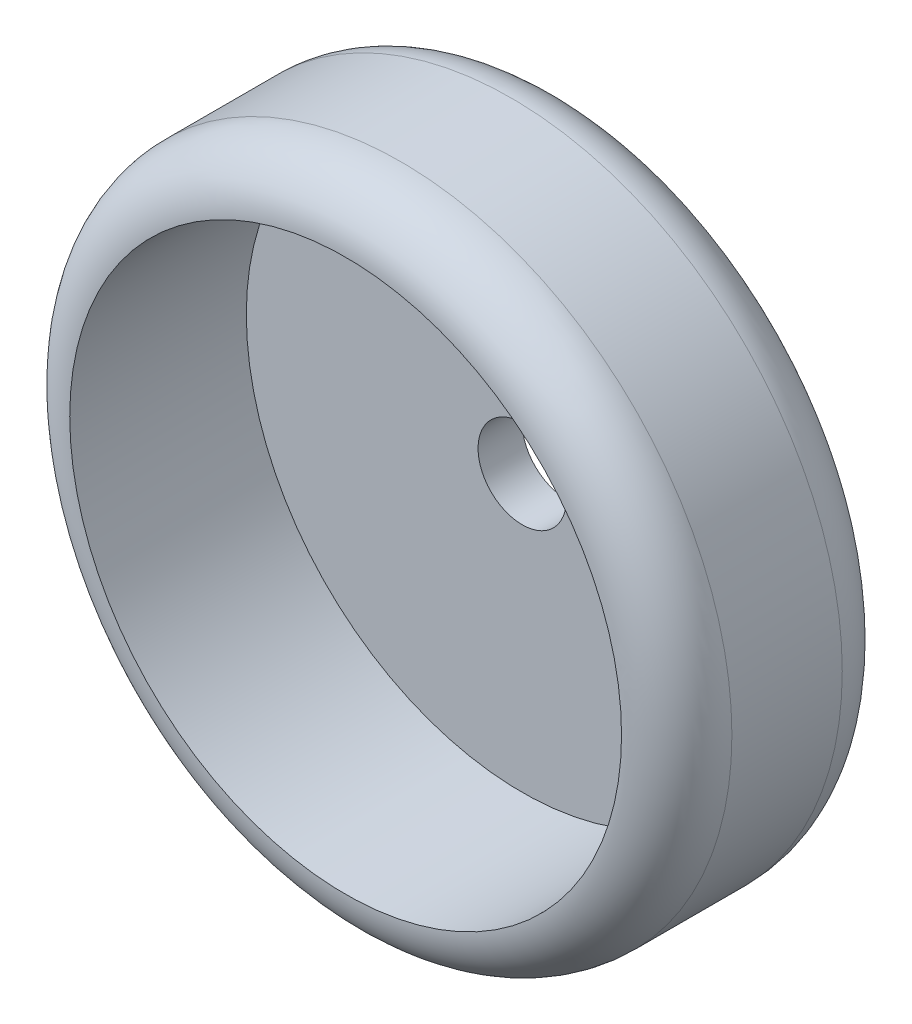
ISO-10303-21;
HEADER;
FILE_DESCRIPTION(('STEP AP214'),'2;1');
FILE_NAME('part.step','',(''),(''),'','','');
FILE_SCHEMA(('AUTOMOTIVE_DESIGN { 1 0 10303 214 1 1 1 1 }'));
ENDSEC;
DATA;
#1=APPLICATION_CONTEXT('core data for automotive mechanical design processes');
#2=APPLICATION_PROTOCOL_DEFINITION('international standard','automotive_design',2000,#1);
#3=PRODUCT_CONTEXT('',#1,'mechanical');
#4=PRODUCT('Part','Part','',(#3));
#5=PRODUCT_RELATED_PRODUCT_CATEGORY('part','',(#4));
#6=PRODUCT_DEFINITION_FORMATION('','',#4);
#7=PRODUCT_DEFINITION_CONTEXT('part definition',#1,'design');
#8=PRODUCT_DEFINITION('design','',#6,#7);
#9=PRODUCT_DEFINITION_SHAPE('','',#8);
#10=(LENGTH_UNIT() NAMED_UNIT(*) SI_UNIT(.MILLI.,.METRE.));
#11=(NAMED_UNIT(*) PLANE_ANGLE_UNIT() SI_UNIT($,.RADIAN.));
#12=(NAMED_UNIT(*) SI_UNIT($,.STERADIAN.) SOLID_ANGLE_UNIT());
#13=UNCERTAINTY_MEASURE_WITH_UNIT(LENGTH_MEASURE(1.E-05),#10,'distance_accuracy_value','');
#14=(GEOMETRIC_REPRESENTATION_CONTEXT(3) GLOBAL_UNCERTAINTY_ASSIGNED_CONTEXT((#13)) GLOBAL_UNIT_ASSIGNED_CONTEXT((#10,
#11,#12)) REPRESENTATION_CONTEXT('',''));
#15=CARTESIAN_POINT('',(0.,0.,0.));
#16=DIRECTION('',(0.,0.,1.));
#17=DIRECTION('',(1.,0.,0.));
#18=AXIS2_PLACEMENT_3D('',#15,#16,#17);
#19=CARTESIAN_POINT('',(0.,0.,20.));
#20=DIRECTION('',(0.,0.,-1.));
#21=DIRECTION('',(-1.,0.,0.));
#22=AXIS2_PLACEMENT_3D('',#19,#20,#21);
#23=CYLINDRICAL_SURFACE('',#22,4.);
#24=CARTESIAN_POINT('',(0.,0.,0.));
#25=DIRECTION('',(0.,0.,1.));
#26=DIRECTION('',(1.,0.,0.));
#27=AXIS2_PLACEMENT_3D('',#24,#25,#26);
#28=CIRCLE('',#27,4.);
#29=CARTESIAN_POINT('',(4.,0.,0.));
#30=VERTEX_POINT('',#29);
#31=EDGE_CURVE('E53',#30,#30,#28,.T.);
#32=ORIENTED_EDGE('',*,*,#31,.F.);
#33=EDGE_LOOP('',(#32));
#34=FACE_BOUND('',#33,.T.);
#35=CARTESIAN_POINT('',(0.,0.,3.99999999999997));
#36=DIRECTION('',(0.,0.,1.));
#37=DIRECTION('',(1.,0.,0.));
#38=AXIS2_PLACEMENT_3D('',#35,#36,#37);
#39=CIRCLE('',#38,4.);
#40=CARTESIAN_POINT('',(4.,0.,3.99999999999997));
#41=VERTEX_POINT('',#40);
#42=EDGE_CURVE('E60',#41,#41,#39,.T.);
#43=ORIENTED_EDGE('',*,*,#42,.T.);
#44=EDGE_LOOP('',(#43));
#45=FACE_BOUND('',#44,.T.);
#46=ADVANCED_FACE('F39',(#34,#45),#23,.F.);
#47=CARTESIAN_POINT('',(0.,0.,0.));
#48=DIRECTION('',(0.,0.,1.));
#49=DIRECTION('',(1.,0.,0.));
#50=AXIS2_PLACEMENT_3D('',#47,#48,#49);
#51=PLANE('',#50);
#52=CARTESIAN_POINT('',(0.,0.,0.));
#53=DIRECTION('',(0.,0.,1.));
#54=DIRECTION('',(1.,0.,0.));
#55=AXIS2_PLACEMENT_3D('',#52,#53,#54);
#56=CIRCLE('',#55,25.);
#57=CARTESIAN_POINT('',(25.,0.,0.));
#58=VERTEX_POINT('',#57);
#59=EDGE_CURVE('E10',#58,#58,#56,.F.);
#60=ORIENTED_EDGE('',*,*,#59,.T.);
#61=EDGE_LOOP('',(#60));
#62=FACE_BOUND('',#61,.T.);
#63=ORIENTED_EDGE('',*,*,#31,.T.);
#64=EDGE_LOOP('',(#63));
#65=FACE_BOUND('',#64,.T.);
#66=ADVANCED_FACE('F90',(#62,#65),#51,.F.);
#67=CARTESIAN_POINT('',(0.,0.,20.));
#68=DIRECTION('',(0.,0.,-1.));
#69=DIRECTION('',(-1.,0.,0.));
#70=AXIS2_PLACEMENT_3D('',#67,#68,#69);
#71=CYLINDRICAL_SURFACE('',#70,30.);
#72=CARTESIAN_POINT('',(0.,0.,5.));
#73=DIRECTION('',(0.,0.,1.));
#74=DIRECTION('',(1.,0.,0.));
#75=AXIS2_PLACEMENT_3D('',#72,#73,#74);
#76=CIRCLE('',#75,30.);
#77=CARTESIAN_POINT('',(30.,0.,5.));
#78=VERTEX_POINT('',#77);
#79=EDGE_CURVE('E46',#78,#78,#76,.T.);
#80=ORIENTED_EDGE('',*,*,#79,.T.);
#81=EDGE_LOOP('',(#80));
#82=FACE_BOUND('',#81,.T.);
#83=CARTESIAN_POINT('',(0.,0.,15.));
#84=DIRECTION('',(0.,0.,1.));
#85=DIRECTION('',(1.,0.,0.));
#86=AXIS2_PLACEMENT_3D('',#83,#84,#85);
#87=CIRCLE('',#86,30.);
#88=CARTESIAN_POINT('',(30.,0.,15.));
#89=VERTEX_POINT('',#88);
#90=EDGE_CURVE('E49',#89,#89,#87,.F.);
#91=ORIENTED_EDGE('',*,*,#90,.T.);
#92=EDGE_LOOP('',(#91));
#93=FACE_BOUND('',#92,.T.);
#94=ADVANCED_FACE('F74',(#82,#93),#71,.T.);
#95=CARTESIAN_POINT('',(0.,0.,3.99999999999997));
#96=DIRECTION('',(0.,0.,1.));
#97=DIRECTION('',(1.,0.,0.));
#98=AXIS2_PLACEMENT_3D('',#95,#96,#97);
#99=CYLINDRICAL_SURFACE('',#98,25.);
#100=CARTESIAN_POINT('',(0.,0.,3.99999999999997));
#101=DIRECTION('',(0.,0.,1.));
#102=DIRECTION('',(1.,0.,0.));
#103=AXIS2_PLACEMENT_3D('',#100,#101,#102);
#104=CIRCLE('',#103,25.);
#105=CARTESIAN_POINT('',(25.,0.,3.99999999999997));
#106=VERTEX_POINT('',#105);
#107=EDGE_CURVE('E58',#106,#106,#104,.T.);
#108=ORIENTED_EDGE('',*,*,#107,.F.);
#109=EDGE_LOOP('',(#108));
#110=FACE_BOUND('',#109,.T.);
#111=CARTESIAN_POINT('',(0.,0.,20.));
#112=DIRECTION('',(0.,0.,1.));
#113=DIRECTION('',(1.,0.,0.));
#114=AXIS2_PLACEMENT_3D('',#111,#112,#113);
#115=CIRCLE('',#114,25.);
#116=CARTESIAN_POINT('',(25.,0.,20.));
#117=VERTEX_POINT('',#116);
#118=EDGE_CURVE('E64',#117,#117,#115,.T.);
#119=ORIENTED_EDGE('',*,*,#118,.T.);
#120=EDGE_LOOP('',(#119));
#121=FACE_BOUND('',#120,.T.);
#122=ADVANCED_FACE('F73',(#110,#121),#99,.F.);
#123=CARTESIAN_POINT('',(0.,0.,3.99999999999997));
#124=DIRECTION('',(0.,0.,1.));
#125=DIRECTION('',(1.,0.,0.));
#126=AXIS2_PLACEMENT_3D('',#123,#124,#125);
#127=PLANE('',#126);
#128=ORIENTED_EDGE('',*,*,#42,.F.);
#129=EDGE_LOOP('',(#128));
#130=FACE_BOUND('',#129,.T.);
#131=ORIENTED_EDGE('',*,*,#107,.T.);
#132=EDGE_LOOP('',(#131));
#133=FACE_BOUND('',#132,.T.);
#134=ADVANCED_FACE('F67',(#130,#133),#127,.T.);
#135=CARTESIAN_POINT('',(0.,0.,5.));
#136=DIRECTION('',(0.,0.,1.));
#137=DIRECTION('',(1.,0.,0.));
#138=AXIS2_PLACEMENT_3D('',#135,#136,#137);
#139=TOROIDAL_SURFACE('',#138,25.,5.);
#140=ORIENTED_EDGE('',*,*,#59,.F.);
#141=EDGE_LOOP('',(#140));
#142=FACE_BOUND('',#141,.T.);
#143=ORIENTED_EDGE('',*,*,#79,.F.);
#144=EDGE_LOOP('',(#143));
#145=FACE_BOUND('',#144,.T.);
#146=ADVANCED_FACE('F79',(#142,#145),#139,.T.);
#147=CARTESIAN_POINT('',(0.,0.,15.));
#148=DIRECTION('',(0.,0.,1.));
#149=DIRECTION('',(1.,0.,0.));
#150=AXIS2_PLACEMENT_3D('',#147,#148,#149);
#151=TOROIDAL_SURFACE('',#150,25.,5.);
#152=ORIENTED_EDGE('',*,*,#90,.F.);
#153=EDGE_LOOP('',(#152));
#154=FACE_BOUND('',#153,.T.);
#155=ORIENTED_EDGE('',*,*,#118,.F.);
#156=EDGE_LOOP('',(#155));
#157=FACE_BOUND('',#156,.T.);
#158=ADVANCED_FACE('F41',(#154,#157),#151,.T.);
#159=CLOSED_SHELL('',(#46,#66,#94,#122,#134,#146,#158));
#160=MANIFOLD_SOLID_BREP('B2',#159);
#161=ADVANCED_BREP_SHAPE_REPRESENTATION('',(#18,#160),#14);
#162=SHAPE_DEFINITION_REPRESENTATION(#9,#161);
ENDSEC;
END-ISO-10303-21;
